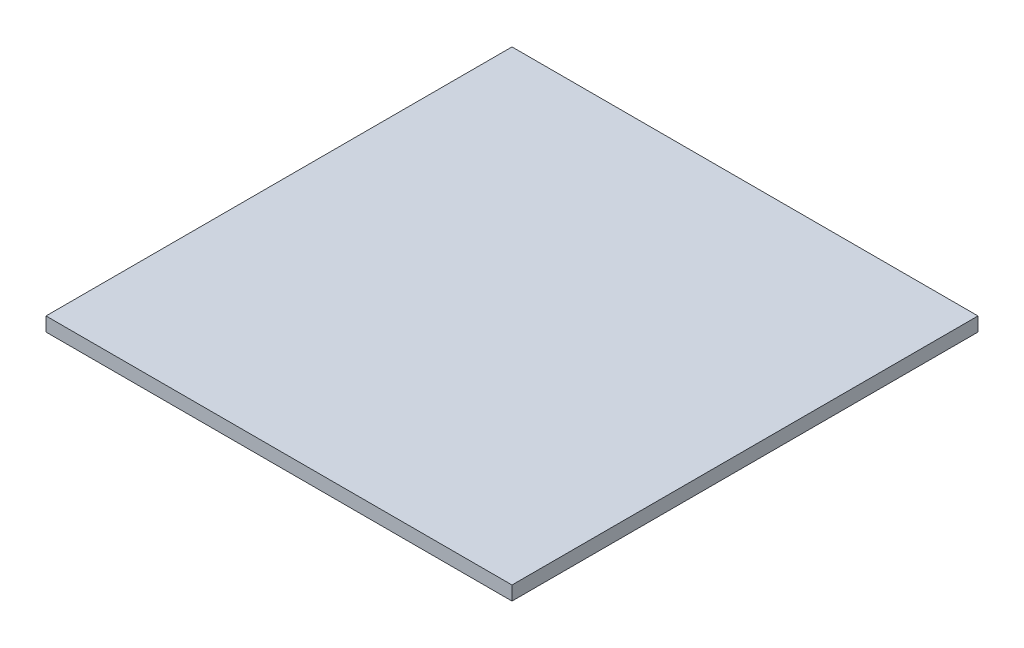
ISO-10303-21;
HEADER;
FILE_DESCRIPTION(('STEP AP214'),'2;1');
FILE_NAME('part.step','',(''),(''),'','','');
FILE_SCHEMA(('AUTOMOTIVE_DESIGN { 1 0 10303 214 1 1 1 1 }'));
ENDSEC;
DATA;
#1=APPLICATION_CONTEXT('core data for automotive mechanical design processes');
#2=APPLICATION_PROTOCOL_DEFINITION('international standard','automotive_design',2000,#1);
#3=PRODUCT_CONTEXT('',#1,'mechanical');
#4=PRODUCT('Part','Part','',(#3));
#5=PRODUCT_RELATED_PRODUCT_CATEGORY('part','',(#4));
#6=PRODUCT_DEFINITION_FORMATION('','',#4);
#7=PRODUCT_DEFINITION_CONTEXT('part definition',#1,'design');
#8=PRODUCT_DEFINITION('design','',#6,#7);
#9=PRODUCT_DEFINITION_SHAPE('','',#8);
#10=(LENGTH_UNIT() NAMED_UNIT(*) SI_UNIT(.MILLI.,.METRE.));
#11=(NAMED_UNIT(*) PLANE_ANGLE_UNIT() SI_UNIT($,.RADIAN.));
#12=(NAMED_UNIT(*) SI_UNIT($,.STERADIAN.) SOLID_ANGLE_UNIT());
#13=UNCERTAINTY_MEASURE_WITH_UNIT(LENGTH_MEASURE(1.E-05),#10,'distance_accuracy_value','');
#14=(GEOMETRIC_REPRESENTATION_CONTEXT(3) GLOBAL_UNCERTAINTY_ASSIGNED_CONTEXT((#13)) GLOBAL_UNIT_ASSIGNED_CONTEXT((#10,
#11,#12)) REPRESENTATION_CONTEXT('',''));
#15=CARTESIAN_POINT('',(0.,0.,0.));
#16=DIRECTION('',(0.,0.,1.));
#17=DIRECTION('',(1.,0.,0.));
#18=AXIS2_PLACEMENT_3D('',#15,#16,#17);
#19=CARTESIAN_POINT('',(0.,0.3,0.));
#20=DIRECTION('',(1.,0.,0.));
#21=DIRECTION('',(0.,0.,-1.));
#22=AXIS2_PLACEMENT_3D('',#19,#20,#21);
#23=PLANE('',#22);
#24=DIRECTION('',(0.,0.,1.));
#25=VECTOR('',#24,1.);
#26=CARTESIAN_POINT('',(0.,0.,0.));
#27=LINE('',#26,#25);
#28=CARTESIAN_POINT('',(0.,0.,-10.));
#29=VERTEX_POINT('',#28);
#30=CARTESIAN_POINT('',(0.,0.,0.));
#31=VERTEX_POINT('',#30);
#32=EDGE_CURVE('E96',#29,#31,#27,.T.);
#33=ORIENTED_EDGE('',*,*,#32,.T.);
#34=DIRECTION('',(0.,-1.,0.));
#35=VECTOR('',#34,1.);
#36=CARTESIAN_POINT('',(0.,0.3,0.));
#37=LINE('',#36,#35);
#38=CARTESIAN_POINT('',(0.,0.3,0.));
#39=VERTEX_POINT('',#38);
#40=EDGE_CURVE('E11',#39,#31,#37,.T.);
#41=ORIENTED_EDGE('',*,*,#40,.F.);
#42=DIRECTION('',(0.,0.,1.));
#43=VECTOR('',#42,1.);
#44=CARTESIAN_POINT('',(0.,0.3,0.));
#45=LINE('',#44,#43);
#46=CARTESIAN_POINT('',(0.,0.3,-10.));
#47=VERTEX_POINT('',#46);
#48=EDGE_CURVE('E84',#47,#39,#45,.T.);
#49=ORIENTED_EDGE('',*,*,#48,.F.);
#50=DIRECTION('',(0.,-1.,0.));
#51=VECTOR('',#50,1.);
#52=CARTESIAN_POINT('',(0.,0.3,-10.));
#53=LINE('',#52,#51);
#54=EDGE_CURVE('E92',#47,#29,#53,.T.);
#55=ORIENTED_EDGE('',*,*,#54,.T.);
#56=EDGE_LOOP('',(#33,#41,#49,#55));
#57=FACE_BOUND('',#56,.T.);
#58=ADVANCED_FACE('F33',(#57),#23,.F.);
#59=CARTESIAN_POINT('',(0.,0.3,0.));
#60=DIRECTION('',(0.,0.,-1.));
#61=DIRECTION('',(-1.,0.,0.));
#62=AXIS2_PLACEMENT_3D('',#59,#60,#61);
#63=PLANE('',#62);
#64=DIRECTION('',(1.,0.,0.));
#65=VECTOR('',#64,1.);
#66=CARTESIAN_POINT('',(0.,0.,0.));
#67=LINE('',#66,#65);
#68=CARTESIAN_POINT('',(10.,0.,0.));
#69=VERTEX_POINT('',#68);
#70=EDGE_CURVE('E88',#31,#69,#67,.T.);
#71=ORIENTED_EDGE('',*,*,#70,.T.);
#72=DIRECTION('',(0.,-1.,0.));
#73=VECTOR('',#72,1.);
#74=CARTESIAN_POINT('',(10.,0.3,0.));
#75=LINE('',#74,#73);
#76=CARTESIAN_POINT('',(10.,0.3,0.));
#77=VERTEX_POINT('',#76);
#78=EDGE_CURVE('E41',#77,#69,#75,.T.);
#79=ORIENTED_EDGE('',*,*,#78,.F.);
#80=DIRECTION('',(1.,0.,0.));
#81=VECTOR('',#80,1.);
#82=CARTESIAN_POINT('',(0.,0.3,0.));
#83=LINE('',#82,#81);
#84=EDGE_CURVE('E79',#39,#77,#83,.T.);
#85=ORIENTED_EDGE('',*,*,#84,.F.);
#86=ORIENTED_EDGE('',*,*,#40,.T.);
#87=EDGE_LOOP('',(#71,#79,#85,#86));
#88=FACE_BOUND('',#87,.T.);
#89=ADVANCED_FACE('F87',(#88),#63,.F.);
#90=CARTESIAN_POINT('',(10.,0.3,0.));
#91=DIRECTION('',(-1.,0.,0.));
#92=DIRECTION('',(0.,0.,1.));
#93=AXIS2_PLACEMENT_3D('',#90,#91,#92);
#94=PLANE('',#93);
#95=DIRECTION('',(0.,0.,-1.));
#96=VECTOR('',#95,1.);
#97=CARTESIAN_POINT('',(10.,0.,0.));
#98=LINE('',#97,#96);
#99=CARTESIAN_POINT('',(10.,0.,-10.));
#100=VERTEX_POINT('',#99);
#101=EDGE_CURVE('E66',#69,#100,#98,.T.);
#102=ORIENTED_EDGE('',*,*,#101,.T.);
#103=DIRECTION('',(0.,-1.,0.));
#104=VECTOR('',#103,1.);
#105=CARTESIAN_POINT('',(10.,0.3,-10.));
#106=LINE('',#105,#104);
#107=CARTESIAN_POINT('',(10.,0.3,-10.));
#108=VERTEX_POINT('',#107);
#109=EDGE_CURVE('E89',#108,#100,#106,.T.);
#110=ORIENTED_EDGE('',*,*,#109,.F.);
#111=DIRECTION('',(0.,0.,-1.));
#112=VECTOR('',#111,1.);
#113=CARTESIAN_POINT('',(10.,0.3,0.));
#114=LINE('',#113,#112);
#115=EDGE_CURVE('E82',#77,#108,#114,.T.);
#116=ORIENTED_EDGE('',*,*,#115,.F.);
#117=ORIENTED_EDGE('',*,*,#78,.T.);
#118=EDGE_LOOP('',(#102,#110,#116,#117));
#119=FACE_BOUND('',#118,.T.);
#120=ADVANCED_FACE('F90',(#119),#94,.F.);
#121=CARTESIAN_POINT('',(0.,0.3,-10.));
#122=DIRECTION('',(0.,0.,1.));
#123=DIRECTION('',(1.,0.,0.));
#124=AXIS2_PLACEMENT_3D('',#121,#122,#123);
#125=PLANE('',#124);
#126=DIRECTION('',(-1.,0.,0.));
#127=VECTOR('',#126,1.);
#128=CARTESIAN_POINT('',(0.,0.,-10.));
#129=LINE('',#128,#127);
#130=EDGE_CURVE('E72',#100,#29,#129,.T.);
#131=ORIENTED_EDGE('',*,*,#130,.T.);
#132=ORIENTED_EDGE('',*,*,#54,.F.);
#133=DIRECTION('',(-1.,0.,0.));
#134=VECTOR('',#133,1.);
#135=CARTESIAN_POINT('',(0.,0.3,-10.));
#136=LINE('',#135,#134);
#137=EDGE_CURVE('E49',#108,#47,#136,.T.);
#138=ORIENTED_EDGE('',*,*,#137,.F.);
#139=ORIENTED_EDGE('',*,*,#109,.T.);
#140=EDGE_LOOP('',(#131,#132,#138,#139));
#141=FACE_BOUND('',#140,.T.);
#142=ADVANCED_FACE('F103',(#141),#125,.F.);
#143=CARTESIAN_POINT('',(0.,0.3,0.));
#144=DIRECTION('',(0.,-1.,0.));
#145=DIRECTION('',(0.,0.,-1.));
#146=AXIS2_PLACEMENT_3D('',#143,#144,#145);
#147=PLANE('',#146);
#148=ORIENTED_EDGE('',*,*,#48,.T.);
#149=ORIENTED_EDGE('',*,*,#84,.T.);
#150=ORIENTED_EDGE('',*,*,#115,.T.);
#151=ORIENTED_EDGE('',*,*,#137,.T.);
#152=EDGE_LOOP('',(#148,#149,#150,#151));
#153=FACE_BOUND('',#152,.T.);
#154=ADVANCED_FACE('F80',(#153),#147,.F.);
#155=CARTESIAN_POINT('',(0.,0.,0.));
#156=DIRECTION('',(0.,-1.,0.));
#157=DIRECTION('',(0.,0.,-1.));
#158=AXIS2_PLACEMENT_3D('',#155,#156,#157);
#159=PLANE('',#158);
#160=ORIENTED_EDGE('',*,*,#32,.F.);
#161=ORIENTED_EDGE('',*,*,#130,.F.);
#162=ORIENTED_EDGE('',*,*,#101,.F.);
#163=ORIENTED_EDGE('',*,*,#70,.F.);
#164=EDGE_LOOP('',(#160,#161,#162,#163));
#165=FACE_BOUND('',#164,.T.);
#166=ADVANCED_FACE('F106',(#165),#159,.T.);
#167=CLOSED_SHELL('',(#58,#89,#120,#142,#154,#166));
#168=MANIFOLD_SOLID_BREP('B2',#167);
#169=ADVANCED_BREP_SHAPE_REPRESENTATION('',(#18,#168),#14);
#170=SHAPE_DEFINITION_REPRESENTATION(#9,#169);
ENDSEC;
END-ISO-10303-21;
